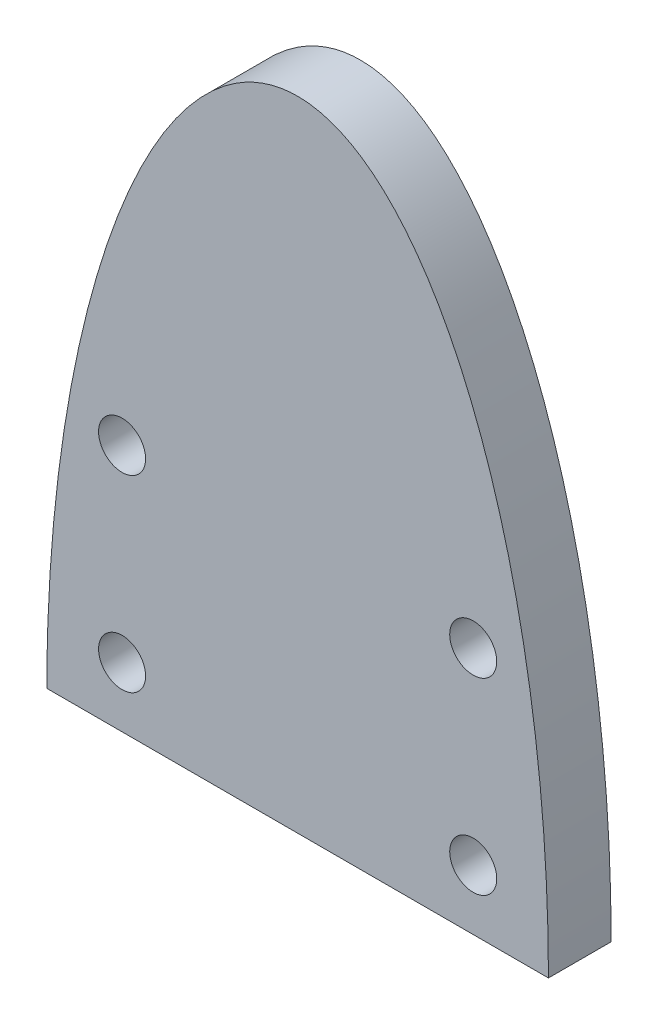
ISO-10303-21;
HEADER;
FILE_DESCRIPTION(('STEP AP214'),'2;1');
FILE_NAME('part.step','',(''),(''),'','','');
FILE_SCHEMA(('AUTOMOTIVE_DESIGN { 1 0 10303 214 1 1 1 1 }'));
ENDSEC;
DATA;
#1=APPLICATION_CONTEXT('core data for automotive mechanical design processes');
#2=APPLICATION_PROTOCOL_DEFINITION('international standard','automotive_design',2000,#1);
#3=PRODUCT_CONTEXT('',#1,'mechanical');
#4=PRODUCT('Part','Part','',(#3));
#5=PRODUCT_RELATED_PRODUCT_CATEGORY('part','',(#4));
#6=PRODUCT_DEFINITION_FORMATION('','',#4);
#7=PRODUCT_DEFINITION_CONTEXT('part definition',#1,'design');
#8=PRODUCT_DEFINITION('design','',#6,#7);
#9=PRODUCT_DEFINITION_SHAPE('','',#8);
#10=(LENGTH_UNIT() NAMED_UNIT(*) SI_UNIT(.MILLI.,.METRE.));
#11=(NAMED_UNIT(*) PLANE_ANGLE_UNIT() SI_UNIT($,.RADIAN.));
#12=(NAMED_UNIT(*) SI_UNIT($,.STERADIAN.) SOLID_ANGLE_UNIT());
#13=UNCERTAINTY_MEASURE_WITH_UNIT(LENGTH_MEASURE(1.E-05),#10,'distance_accuracy_value','');
#14=(GEOMETRIC_REPRESENTATION_CONTEXT(3) GLOBAL_UNCERTAINTY_ASSIGNED_CONTEXT((#13)) GLOBAL_UNIT_ASSIGNED_CONTEXT((#10,
#11,#12)) REPRESENTATION_CONTEXT('',''));
#15=CARTESIAN_POINT('',(0.,0.,0.));
#16=DIRECTION('',(0.,0.,1.));
#17=DIRECTION('',(1.,0.,0.));
#18=AXIS2_PLACEMENT_3D('',#15,#16,#17);
#19=CARTESIAN_POINT('',(50.8,-1.11022302462516E-13,12.7));
#20=DIRECTION('',(0.,0.,1.));
#21=DIRECTION('',(0.,1.,0.));
#22=AXIS2_PLACEMENT_3D('',#19,#20,#21);
#23=ELLIPSE('',#22,129.286,50.8);
#24=DIRECTION('',(0.,0.,-1.));
#25=VECTOR('',#24,1.);
#26=SURFACE_OF_LINEAR_EXTRUSION('',#23,#25);
#27=CARTESIAN_POINT('',(50.8,0.,0.));
#28=DIRECTION('',(0.,0.,1.));
#29=DIRECTION('',(0.,1.,0.));
#30=AXIS2_PLACEMENT_3D('',#27,#28,#29);
#31=ELLIPSE('',#30,129.286,50.8);
#32=CARTESIAN_POINT('',(101.6,0.,0.));
#33=VERTEX_POINT('',#32);
#34=CARTESIAN_POINT('',(0.,0.,0.));
#35=VERTEX_POINT('',#34);
#36=EDGE_CURVE('E77',#33,#35,#31,.T.);
#37=ORIENTED_EDGE('',*,*,#36,.T.);
#38=DIRECTION('',(0.,0.,-1.));
#39=VECTOR('',#38,1.);
#40=CARTESIAN_POINT('',(0.,0.,12.7));
#41=LINE('',#40,#39);
#42=CARTESIAN_POINT('',(0.,0.,12.7));
#43=VERTEX_POINT('',#42);
#44=EDGE_CURVE('E13',#43,#35,#41,.T.);
#45=ORIENTED_EDGE('',*,*,#44,.F.);
#46=CARTESIAN_POINT('',(101.6,0.,12.7));
#47=VERTEX_POINT('',#46);
#48=EDGE_CURVE('E76',#47,#43,#23,.T.);
#49=ORIENTED_EDGE('',*,*,#48,.F.);
#50=DIRECTION('',(0.,0.,-1.));
#51=VECTOR('',#50,1.);
#52=CARTESIAN_POINT('',(101.6,0.,12.7));
#53=LINE('',#52,#51);
#54=EDGE_CURVE('E54',#47,#33,#53,.T.);
#55=ORIENTED_EDGE('',*,*,#54,.T.);
#56=EDGE_LOOP('',(#37,#45,#49,#55));
#57=FACE_BOUND('',#56,.T.);
#58=ADVANCED_FACE('F45',(#57),#26,.F.);
#59=CARTESIAN_POINT('',(0.,0.,12.7));
#60=DIRECTION('',(0.,1.,0.));
#61=DIRECTION('',(0.,0.,1.));
#62=AXIS2_PLACEMENT_3D('',#59,#60,#61);
#63=PLANE('',#62);
#64=DIRECTION('',(1.,0.,0.));
#65=VECTOR('',#64,1.);
#66=CARTESIAN_POINT('',(0.,0.,0.));
#67=LINE('',#66,#65);
#68=EDGE_CURVE('E69',#35,#33,#67,.T.);
#69=ORIENTED_EDGE('',*,*,#68,.T.);
#70=ORIENTED_EDGE('',*,*,#54,.F.);
#71=DIRECTION('',(1.,0.,0.));
#72=VECTOR('',#71,1.);
#73=CARTESIAN_POINT('',(0.,0.,12.7));
#74=LINE('',#73,#72);
#75=EDGE_CURVE('E61',#43,#47,#74,.T.);
#76=ORIENTED_EDGE('',*,*,#75,.F.);
#77=ORIENTED_EDGE('',*,*,#44,.T.);
#78=EDGE_LOOP('',(#69,#70,#76,#77));
#79=FACE_BOUND('',#78,.T.);
#80=ADVANCED_FACE('F72',(#79),#63,.F.);
#81=CARTESIAN_POINT('',(50.8,-1.11022302462516E-13,12.7));
#82=DIRECTION('',(0.,0.,1.));
#83=DIRECTION('',(1.,0.,0.));
#84=AXIS2_PLACEMENT_3D('',#81,#82,#83);
#85=PLANE('',#84);
#86=CARTESIAN_POINT('',(86.36,12.1665999999999,12.6999999999999));
#87=DIRECTION('',(0.,0.,-1.));
#88=DIRECTION('',(-1.,0.,0.));
#89=AXIS2_PLACEMENT_3D('',#86,#87,#88);
#90=CIRCLE('',#89,4.7625);
#91=CARTESIAN_POINT('',(81.5975,12.1665999999999,12.6999999999999));
#92=VERTEX_POINT('',#91);
#93=EDGE_CURVE('E90',#92,#92,#90,.T.);
#94=ORIENTED_EDGE('',*,*,#93,.T.);
#95=EDGE_LOOP('',(#94));
#96=FACE_BOUND('',#95,.T.);
#97=CARTESIAN_POINT('',(15.24,50.2666,12.7));
#98=DIRECTION('',(0.,0.,-1.));
#99=DIRECTION('',(-1.,0.,0.));
#100=AXIS2_PLACEMENT_3D('',#97,#98,#99);
#101=CIRCLE('',#100,4.7625);
#102=CARTESIAN_POINT('',(10.4775,50.2666,12.7));
#103=VERTEX_POINT('',#102);
#104=EDGE_CURVE('E95',#103,#103,#101,.T.);
#105=ORIENTED_EDGE('',*,*,#104,.T.);
#106=EDGE_LOOP('',(#105));
#107=FACE_BOUND('',#106,.T.);
#108=CARTESIAN_POINT('',(15.24,12.1666,12.7));
#109=DIRECTION('',(0.,0.,-1.));
#110=DIRECTION('',(-1.,0.,0.));
#111=AXIS2_PLACEMENT_3D('',#108,#109,#110);
#112=CIRCLE('',#111,4.7625);
#113=CARTESIAN_POINT('',(10.4775,12.1666,12.7));
#114=VERTEX_POINT('',#113);
#115=EDGE_CURVE('E96',#114,#114,#112,.T.);
#116=ORIENTED_EDGE('',*,*,#115,.T.);
#117=EDGE_LOOP('',(#116));
#118=FACE_BOUND('',#117,.T.);
#119=CARTESIAN_POINT('',(86.36,50.2665999999999,12.6999999999999));
#120=DIRECTION('',(0.,0.,-1.));
#121=DIRECTION('',(-1.,0.,0.));
#122=AXIS2_PLACEMENT_3D('',#119,#120,#121);
#123=CIRCLE('',#122,4.7625);
#124=CARTESIAN_POINT('',(81.5975,50.2665999999999,12.6999999999999));
#125=VERTEX_POINT('',#124);
#126=EDGE_CURVE('E81',#125,#125,#123,.T.);
#127=ORIENTED_EDGE('',*,*,#126,.T.);
#128=EDGE_LOOP('',(#127));
#129=FACE_BOUND('',#128,.T.);
#130=ORIENTED_EDGE('',*,*,#48,.T.);
#131=ORIENTED_EDGE('',*,*,#75,.T.);
#132=EDGE_LOOP('',(#130,#131));
#133=FACE_BOUND('',#132,.T.);
#134=ADVANCED_FACE('F110',(#96,#107,#118,#129,#133),#85,.T.);
#135=CARTESIAN_POINT('',(50.8,0.,0.));
#136=DIRECTION('',(0.,0.,1.));
#137=DIRECTION('',(1.,0.,0.));
#138=AXIS2_PLACEMENT_3D('',#135,#136,#137);
#139=PLANE('',#138);
#140=CARTESIAN_POINT('',(86.36,12.1665999999999,-1.11022302462516E-13));
#141=DIRECTION('',(0.,0.,-1.));
#142=DIRECTION('',(-1.,0.,0.));
#143=AXIS2_PLACEMENT_3D('',#140,#141,#142);
#144=CIRCLE('',#143,4.7625);
#145=CARTESIAN_POINT('',(81.5975,12.1665999999999,-1.11022302462516E-13));
#146=VERTEX_POINT('',#145);
#147=EDGE_CURVE('E99',#146,#146,#144,.T.);
#148=ORIENTED_EDGE('',*,*,#147,.F.);
#149=EDGE_LOOP('',(#148));
#150=FACE_BOUND('',#149,.T.);
#151=CARTESIAN_POINT('',(15.24,50.2666,0.));
#152=DIRECTION('',(0.,0.,-1.));
#153=DIRECTION('',(-1.,0.,0.));
#154=AXIS2_PLACEMENT_3D('',#151,#152,#153);
#155=CIRCLE('',#154,4.7625);
#156=CARTESIAN_POINT('',(10.4775,50.2666,0.));
#157=VERTEX_POINT('',#156);
#158=EDGE_CURVE('E92',#157,#157,#155,.T.);
#159=ORIENTED_EDGE('',*,*,#158,.F.);
#160=EDGE_LOOP('',(#159));
#161=FACE_BOUND('',#160,.T.);
#162=CARTESIAN_POINT('',(15.24,12.1666,0.));
#163=DIRECTION('',(0.,0.,-1.));
#164=DIRECTION('',(-1.,0.,0.));
#165=AXIS2_PLACEMENT_3D('',#162,#163,#164);
#166=CIRCLE('',#165,4.7625);
#167=CARTESIAN_POINT('',(10.4775,12.1666,0.));
#168=VERTEX_POINT('',#167);
#169=EDGE_CURVE('E104',#168,#168,#166,.T.);
#170=ORIENTED_EDGE('',*,*,#169,.F.);
#171=EDGE_LOOP('',(#170));
#172=FACE_BOUND('',#171,.T.);
#173=CARTESIAN_POINT('',(86.36,50.2665999999999,-1.11022302462516E-13));
#174=DIRECTION('',(0.,0.,-1.));
#175=DIRECTION('',(-1.,0.,0.));
#176=AXIS2_PLACEMENT_3D('',#173,#174,#175);
#177=CIRCLE('',#176,4.7625);
#178=CARTESIAN_POINT('',(81.5975,50.2665999999999,-1.11022302462516E-13));
#179=VERTEX_POINT('',#178);
#180=EDGE_CURVE('E84',#179,#179,#177,.T.);
#181=ORIENTED_EDGE('',*,*,#180,.F.);
#182=EDGE_LOOP('',(#181));
#183=FACE_BOUND('',#182,.T.);
#184=ORIENTED_EDGE('',*,*,#36,.F.);
#185=ORIENTED_EDGE('',*,*,#68,.F.);
#186=EDGE_LOOP('',(#184,#185));
#187=FACE_BOUND('',#186,.T.);
#188=ADVANCED_FACE('F80',(#150,#161,#172,#183,#187),#139,.F.);
#189=CARTESIAN_POINT('',(86.36,50.2665999999999,12.6999999999999));
#190=DIRECTION('',(0.,0.,-1.));
#191=DIRECTION('',(-1.,0.,0.));
#192=AXIS2_PLACEMENT_3D('',#189,#190,#191);
#193=CYLINDRICAL_SURFACE('',#192,4.7625);
#194=ORIENTED_EDGE('',*,*,#126,.F.);
#195=EDGE_LOOP('',(#194));
#196=FACE_BOUND('',#195,.T.);
#197=ORIENTED_EDGE('',*,*,#180,.T.);
#198=EDGE_LOOP('',(#197));
#199=FACE_BOUND('',#198,.T.);
#200=ADVANCED_FACE('F117',(#196,#199),#193,.F.);
#201=CARTESIAN_POINT('',(15.24,12.1666,12.7));
#202=DIRECTION('',(0.,0.,-1.));
#203=DIRECTION('',(-1.,0.,0.));
#204=AXIS2_PLACEMENT_3D('',#201,#202,#203);
#205=CYLINDRICAL_SURFACE('',#204,4.7625);
#206=ORIENTED_EDGE('',*,*,#115,.F.);
#207=EDGE_LOOP('',(#206));
#208=FACE_BOUND('',#207,.T.);
#209=ORIENTED_EDGE('',*,*,#169,.T.);
#210=EDGE_LOOP('',(#209));
#211=FACE_BOUND('',#210,.T.);
#212=ADVANCED_FACE('F113',(#208,#211),#205,.F.);
#213=CARTESIAN_POINT('',(15.24,50.2666,12.7));
#214=DIRECTION('',(0.,0.,-1.));
#215=DIRECTION('',(-1.,0.,0.));
#216=AXIS2_PLACEMENT_3D('',#213,#214,#215);
#217=CYLINDRICAL_SURFACE('',#216,4.7625);
#218=ORIENTED_EDGE('',*,*,#104,.F.);
#219=EDGE_LOOP('',(#218));
#220=FACE_BOUND('',#219,.T.);
#221=ORIENTED_EDGE('',*,*,#158,.T.);
#222=EDGE_LOOP('',(#221));
#223=FACE_BOUND('',#222,.T.);
#224=ADVANCED_FACE('F116',(#220,#223),#217,.F.);
#225=CARTESIAN_POINT('',(86.36,12.1665999999999,12.6999999999999));
#226=DIRECTION('',(0.,0.,-1.));
#227=DIRECTION('',(-1.,0.,0.));
#228=AXIS2_PLACEMENT_3D('',#225,#226,#227);
#229=CYLINDRICAL_SURFACE('',#228,4.7625);
#230=ORIENTED_EDGE('',*,*,#93,.F.);
#231=EDGE_LOOP('',(#230));
#232=FACE_BOUND('',#231,.T.);
#233=ORIENTED_EDGE('',*,*,#147,.T.);
#234=EDGE_LOOP('',(#233));
#235=FACE_BOUND('',#234,.T.);
#236=ADVANCED_FACE('F151',(#232,#235),#229,.F.);
#237=CLOSED_SHELL('',(#58,#80,#134,#188,#200,#212,#224,#236));
#238=MANIFOLD_SOLID_BREP('B2',#237);
#239=ADVANCED_BREP_SHAPE_REPRESENTATION('',(#18,#238),#14);
#240=SHAPE_DEFINITION_REPRESENTATION(#9,#239);
ENDSEC;
END-ISO-10303-21;
